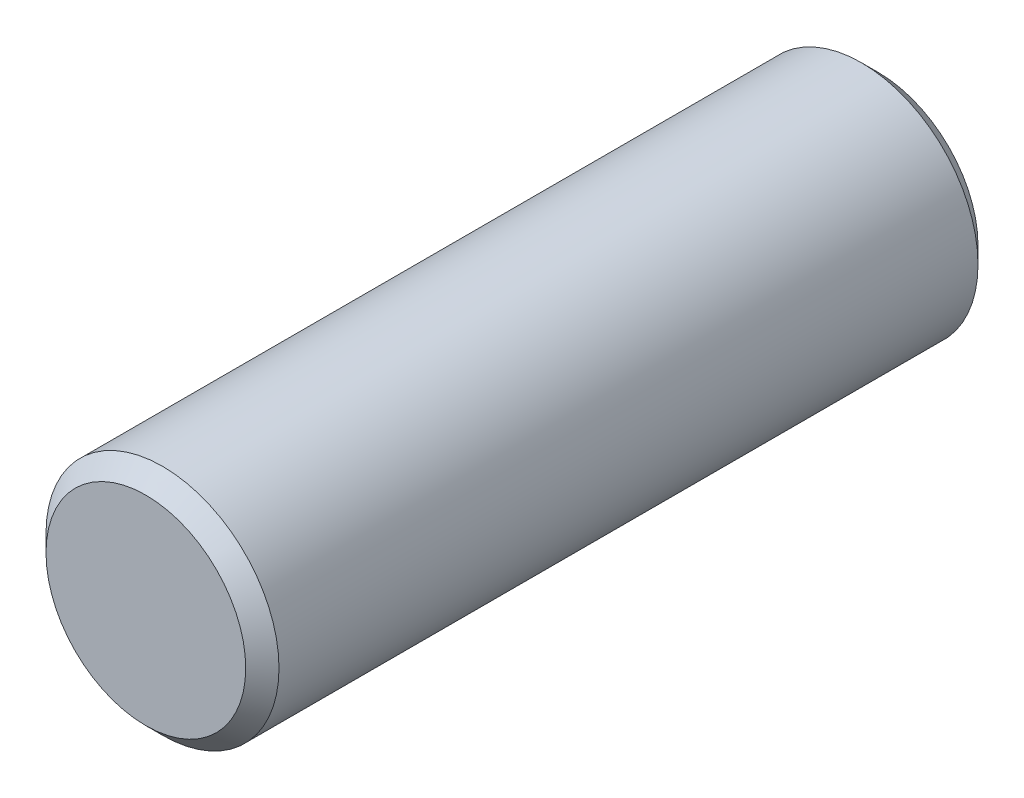
ISO-10303-21;
HEADER;
FILE_DESCRIPTION(('STEP AP214'),'2;1');
FILE_NAME('part.step','',(''),(''),'','','');
FILE_SCHEMA(('AUTOMOTIVE_DESIGN { 1 0 10303 214 1 1 1 1 }'));
ENDSEC;
DATA;
#1=APPLICATION_CONTEXT('core data for automotive mechanical design processes');
#2=APPLICATION_PROTOCOL_DEFINITION('international standard','automotive_design',2000,#1);
#3=PRODUCT_CONTEXT('',#1,'mechanical');
#4=PRODUCT('Part','Part','',(#3));
#5=PRODUCT_RELATED_PRODUCT_CATEGORY('part','',(#4));
#6=PRODUCT_DEFINITION_FORMATION('','',#4);
#7=PRODUCT_DEFINITION_CONTEXT('part definition',#1,'design');
#8=PRODUCT_DEFINITION('design','',#6,#7);
#9=PRODUCT_DEFINITION_SHAPE('','',#8);
#10=(LENGTH_UNIT() NAMED_UNIT(*) SI_UNIT(.MILLI.,.METRE.));
#11=(NAMED_UNIT(*) PLANE_ANGLE_UNIT() SI_UNIT($,.RADIAN.));
#12=(NAMED_UNIT(*) SI_UNIT($,.STERADIAN.) SOLID_ANGLE_UNIT());
#13=UNCERTAINTY_MEASURE_WITH_UNIT(LENGTH_MEASURE(1.E-05),#10,'distance_accuracy_value','');
#14=(GEOMETRIC_REPRESENTATION_CONTEXT(3) GLOBAL_UNCERTAINTY_ASSIGNED_CONTEXT((#13)) GLOBAL_UNIT_ASSIGNED_CONTEXT((#10,
#11,#12)) REPRESENTATION_CONTEXT('',''));
#15=CARTESIAN_POINT('',(0.,0.,0.));
#16=DIRECTION('',(0.,0.,1.));
#17=DIRECTION('',(1.,0.,0.));
#18=AXIS2_PLACEMENT_3D('',#15,#16,#17);
#19=CARTESIAN_POINT('',(-74.4634361351468,-51.6981163481169,-22.));
#20=DIRECTION('',(0.,0.,-1.));
#21=DIRECTION('',(0.526825274608604,0.849973605492295,0.));
#22=AXIS2_PLACEMENT_3D('',#19,#20,#21);
#23=PLANE('',#22);
#24=CARTESIAN_POINT('',(0.,0.,-21.9999999999999));
#25=DIRECTION('',(0.,0.,-1.));
#26=DIRECTION('',(0.,1.,0.));
#27=AXIS2_PLACEMENT_3D('',#24,#25,#26);
#28=CIRCLE('',#27,3.);
#29=CARTESIAN_POINT('',(0.,3.00000000000001,-21.9999999999999));
#30=VERTEX_POINT('',#29);
#31=EDGE_CURVE('E10',#30,#30,#28,.T.);
#32=ORIENTED_EDGE('',*,*,#31,.T.);
#33=EDGE_LOOP('',(#32));
#34=FACE_BOUND('',#33,.T.);
#35=ADVANCED_FACE('F29',(#34),#23,.T.);
#36=CARTESIAN_POINT('',(0.,0.,0.));
#37=DIRECTION('',(0.,0.,1.));
#38=DIRECTION('',(1.,0.,0.));
#39=AXIS2_PLACEMENT_3D('',#36,#37,#38);
#40=PLANE('',#39);
#41=CARTESIAN_POINT('',(0.,0.,0.));
#42=DIRECTION('',(0.,0.,1.));
#43=DIRECTION('',(1.,0.,0.));
#44=AXIS2_PLACEMENT_3D('',#41,#42,#43);
#45=CIRCLE('',#44,3.);
#46=CARTESIAN_POINT('',(3.,0.,0.));
#47=VERTEX_POINT('',#46);
#48=EDGE_CURVE('E44',#47,#47,#45,.T.);
#49=ORIENTED_EDGE('',*,*,#48,.T.);
#50=EDGE_LOOP('',(#49));
#51=FACE_BOUND('',#50,.T.);
#52=ADVANCED_FACE('F50',(#51),#40,.T.);
#53=CARTESIAN_POINT('',(0.,0.,-31.8994949366116));
#54=DIRECTION('',(0.,0.,1.));
#55=DIRECTION('',(1.,0.,0.));
#56=AXIS2_PLACEMENT_3D('',#53,#54,#55);
#57=CYLINDRICAL_SURFACE('',#56,3.5);
#58=CARTESIAN_POINT('',(0.,0.,-0.5));
#59=DIRECTION('',(0.,0.,1.));
#60=DIRECTION('',(1.,0.,0.));
#61=AXIS2_PLACEMENT_3D('',#58,#59,#60);
#62=CIRCLE('',#61,3.5);
#63=CARTESIAN_POINT('',(3.5,0.,-0.5));
#64=VERTEX_POINT('',#63);
#65=EDGE_CURVE('E36',#64,#64,#62,.F.);
#66=ORIENTED_EDGE('',*,*,#65,.T.);
#67=EDGE_LOOP('',(#66));
#68=FACE_BOUND('',#67,.T.);
#69=CARTESIAN_POINT('',(0.,0.,-21.4999999999999));
#70=DIRECTION('',(0.,0.,-1.));
#71=DIRECTION('',(-1.,0.,0.));
#72=AXIS2_PLACEMENT_3D('',#69,#70,#71);
#73=CIRCLE('',#72,3.5);
#74=CARTESIAN_POINT('',(-3.50000000000002,0.,-21.4999999999999));
#75=VERTEX_POINT('',#74);
#76=EDGE_CURVE('E40',#75,#75,#73,.F.);
#77=ORIENTED_EDGE('',*,*,#76,.T.);
#78=EDGE_LOOP('',(#77));
#79=FACE_BOUND('',#78,.T.);
#80=ADVANCED_FACE('F54',(#68,#79),#57,.T.);
#81=CARTESIAN_POINT('',(0.,0.,0.));
#82=DIRECTION('',(0.,0.,-1.));
#83=DIRECTION('',(-1.,0.,0.));
#84=AXIS2_PLACEMENT_3D('',#81,#82,#83);
#85=CONICAL_SURFACE('',#84,3.,0.785398163397449);
#86=ORIENTED_EDGE('',*,*,#65,.F.);
#87=EDGE_LOOP('',(#86));
#88=FACE_BOUND('',#87,.T.);
#89=ORIENTED_EDGE('',*,*,#48,.F.);
#90=EDGE_LOOP('',(#89));
#91=FACE_BOUND('',#90,.T.);
#92=ADVANCED_FACE('F52',(#88,#91),#85,.T.);
#93=CARTESIAN_POINT('',(0.,0.,-21.4999999999999));
#94=DIRECTION('',(0.,0.,1.));
#95=DIRECTION('',(1.,0.,0.));
#96=AXIS2_PLACEMENT_3D('',#93,#94,#95);
#97=CONICAL_SURFACE('',#96,3.5,0.785398163397455);
#98=ORIENTED_EDGE('',*,*,#31,.F.);
#99=EDGE_LOOP('',(#98));
#100=FACE_BOUND('',#99,.T.);
#101=ORIENTED_EDGE('',*,*,#76,.F.);
#102=EDGE_LOOP('',(#101));
#103=FACE_BOUND('',#102,.T.);
#104=ADVANCED_FACE('F31',(#100,#103),#97,.T.);
#105=CLOSED_SHELL('',(#35,#52,#80,#92,#104));
#106=MANIFOLD_SOLID_BREP('B2',#105);
#107=ADVANCED_BREP_SHAPE_REPRESENTATION('',(#18,#106),#14);
#108=SHAPE_DEFINITION_REPRESENTATION(#9,#107);
ENDSEC;
END-ISO-10303-21;
